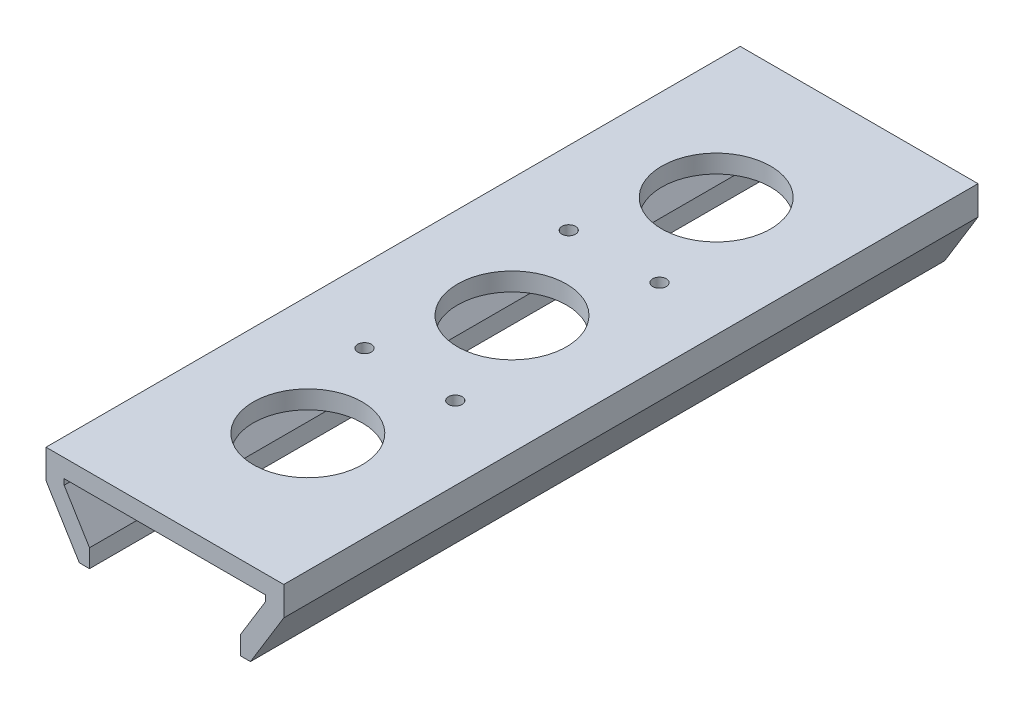
ISO-10303-21;
HEADER;
FILE_DESCRIPTION(('STEP AP214'),'2;1');
FILE_NAME('part.step','',(''),(''),'','','');
FILE_SCHEMA(('AUTOMOTIVE_DESIGN { 1 0 10303 214 1 1 1 1 }'));
ENDSEC;
DATA;
#1=APPLICATION_CONTEXT('core data for automotive mechanical design processes');
#2=APPLICATION_PROTOCOL_DEFINITION('international standard','automotive_design',2000,#1);
#3=PRODUCT_CONTEXT('',#1,'mechanical');
#4=PRODUCT('Part','Part','',(#3));
#5=PRODUCT_RELATED_PRODUCT_CATEGORY('part','',(#4));
#6=PRODUCT_DEFINITION_FORMATION('','',#4);
#7=PRODUCT_DEFINITION_CONTEXT('part definition',#1,'design');
#8=PRODUCT_DEFINITION('design','',#6,#7);
#9=PRODUCT_DEFINITION_SHAPE('','',#8);
#10=(LENGTH_UNIT() NAMED_UNIT(*) SI_UNIT(.MILLI.,.METRE.));
#11=(NAMED_UNIT(*) PLANE_ANGLE_UNIT() SI_UNIT($,.RADIAN.));
#12=(NAMED_UNIT(*) SI_UNIT($,.STERADIAN.) SOLID_ANGLE_UNIT());
#13=UNCERTAINTY_MEASURE_WITH_UNIT(LENGTH_MEASURE(1.E-05),#10,'distance_accuracy_value','');
#14=(GEOMETRIC_REPRESENTATION_CONTEXT(3) GLOBAL_UNCERTAINTY_ASSIGNED_CONTEXT((#13)) GLOBAL_UNIT_ASSIGNED_CONTEXT((#10,
#11,#12)) REPRESENTATION_CONTEXT('',''));
#15=CARTESIAN_POINT('',(0.,0.,0.));
#16=DIRECTION('',(0.,0.,1.));
#17=DIRECTION('',(1.,0.,0.));
#18=AXIS2_PLACEMENT_3D('',#15,#16,#17);
#19=CARTESIAN_POINT('',(0.,-13.28935446553,153.));
#20=DIRECTION('',(0.,-1.,0.));
#21=DIRECTION('',(1.,0.,0.));
#22=AXIS2_PLACEMENT_3D('',#19,#20,#21);
#23=PLANE('',#22);
#24=CARTESIAN_POINT('',(-9.99999999999999,-13.28935446553,54.));
#25=DIRECTION('',(0.,-1.,0.));
#26=DIRECTION('',(1.,0.,0.));
#27=AXIS2_PLACEMENT_3D('',#24,#25,#26);
#28=CIRCLE('',#27,1.5);
#29=CARTESIAN_POINT('',(-8.49999999999999,-13.28935446553,54.));
#30=VERTEX_POINT('',#29);
#31=EDGE_CURVE('E344',#30,#30,#28,.F.);
#32=ORIENTED_EDGE('',*,*,#31,.T.);
#33=EDGE_LOOP('',(#32));
#34=FACE_BOUND('',#33,.T.);
#35=CARTESIAN_POINT('',(10.,-13.28935446553,99.));
#36=DIRECTION('',(0.,-1.,0.));
#37=DIRECTION('',(1.,0.,0.));
#38=AXIS2_PLACEMENT_3D('',#35,#36,#37);
#39=CIRCLE('',#38,1.5);
#40=CARTESIAN_POINT('',(11.5,-13.28935446553,99.));
#41=VERTEX_POINT('',#40);
#42=EDGE_CURVE('E348',#41,#41,#39,.F.);
#43=ORIENTED_EDGE('',*,*,#42,.T.);
#44=EDGE_LOOP('',(#43));
#45=FACE_BOUND('',#44,.T.);
#46=CARTESIAN_POINT('',(0.,-13.28935446553,31.5));
#47=DIRECTION('',(0.,-1.,0.));
#48=DIRECTION('',(1.,0.,0.));
#49=AXIS2_PLACEMENT_3D('',#46,#47,#48);
#50=CIRCLE('',#49,12.);
#51=CARTESIAN_POINT('',(12.,-13.28935446553,31.5));
#52=VERTEX_POINT('',#51);
#53=EDGE_CURVE('E183',#52,#52,#50,.T.);
#54=ORIENTED_EDGE('',*,*,#53,.F.);
#55=EDGE_LOOP('',(#54));
#56=FACE_BOUND('',#55,.T.);
#57=CARTESIAN_POINT('',(0.,-13.28935446553,76.5));
#58=DIRECTION('',(0.,-1.,0.));
#59=DIRECTION('',(1.,0.,0.));
#60=AXIS2_PLACEMENT_3D('',#57,#58,#59);
#61=CIRCLE('',#60,12.);
#62=CARTESIAN_POINT('',(12.,-13.28935446553,76.5));
#63=VERTEX_POINT('',#62);
#64=EDGE_CURVE('E355',#63,#63,#61,.T.);
#65=ORIENTED_EDGE('',*,*,#64,.F.);
#66=EDGE_LOOP('',(#65));
#67=FACE_BOUND('',#66,.T.);
#68=CARTESIAN_POINT('',(0.,-13.28935446553,121.5));
#69=DIRECTION('',(0.,-1.,0.));
#70=DIRECTION('',(1.,0.,0.));
#71=AXIS2_PLACEMENT_3D('',#68,#69,#70);
#72=CIRCLE('',#71,12.);
#73=CARTESIAN_POINT('',(12.,-13.28935446553,121.5));
#74=VERTEX_POINT('',#73);
#75=EDGE_CURVE('E358',#74,#74,#72,.T.);
#76=ORIENTED_EDGE('',*,*,#75,.F.);
#77=EDGE_LOOP('',(#76));
#78=FACE_BOUND('',#77,.T.);
#79=DIRECTION('',(-1.,0.,0.));
#80=VECTOR('',#79,1.);
#81=CARTESIAN_POINT('',(0.,-13.28935446553,0.));
#82=LINE('',#81,#80);
#83=CARTESIAN_POINT('',(22.2,-13.28935446553,0.));
#84=VERTEX_POINT('',#83);
#85=CARTESIAN_POINT('',(-22.2,-13.28935446553,0.));
#86=VERTEX_POINT('',#85);
#87=EDGE_CURVE('E179',#84,#86,#82,.T.);
#88=ORIENTED_EDGE('',*,*,#87,.F.);
#89=DIRECTION('',(0.,0.,-1.));
#90=VECTOR('',#89,1.);
#91=CARTESIAN_POINT('',(22.2,-13.28935446553,153.));
#92=LINE('',#91,#90);
#93=CARTESIAN_POINT('',(22.2,-13.28935446553,153.));
#94=VERTEX_POINT('',#93);
#95=EDGE_CURVE('E11',#94,#84,#92,.T.);
#96=ORIENTED_EDGE('',*,*,#95,.F.);
#97=DIRECTION('',(-1.,0.,0.));
#98=VECTOR('',#97,1.);
#99=CARTESIAN_POINT('',(0.,-13.28935446553,153.));
#100=LINE('',#99,#98);
#101=CARTESIAN_POINT('',(-22.2,-13.28935446553,153.));
#102=VERTEX_POINT('',#101);
#103=EDGE_CURVE('E228',#94,#102,#100,.T.);
#104=ORIENTED_EDGE('',*,*,#103,.T.);
#105=DIRECTION('',(0.,0.,-1.));
#106=VECTOR('',#105,1.);
#107=CARTESIAN_POINT('',(-22.2,-13.28935446553,153.));
#108=LINE('',#107,#106);
#109=EDGE_CURVE('E62',#102,#86,#108,.T.);
#110=ORIENTED_EDGE('',*,*,#109,.T.);
#111=EDGE_LOOP('',(#88,#96,#104,#110));
#112=FACE_BOUND('',#111,.T.);
#113=CARTESIAN_POINT('',(-9.99999999999999,-13.28935446553,99.));
#114=DIRECTION('',(0.,-1.,0.));
#115=DIRECTION('',(1.,0.,0.));
#116=AXIS2_PLACEMENT_3D('',#113,#114,#115);
#117=CIRCLE('',#116,1.5);
#118=CARTESIAN_POINT('',(-8.49999999999999,-13.28935446553,99.));
#119=VERTEX_POINT('',#118);
#120=EDGE_CURVE('E363',#119,#119,#117,.T.);
#121=ORIENTED_EDGE('',*,*,#120,.F.);
#122=EDGE_LOOP('',(#121));
#123=FACE_BOUND('',#122,.T.);
#124=CARTESIAN_POINT('',(10.,-13.28935446553,54.));
#125=DIRECTION('',(0.,-1.,0.));
#126=DIRECTION('',(1.,0.,0.));
#127=AXIS2_PLACEMENT_3D('',#124,#125,#126);
#128=CIRCLE('',#127,1.5);
#129=CARTESIAN_POINT('',(11.5,-13.28935446553,54.));
#130=VERTEX_POINT('',#129);
#131=EDGE_CURVE('E366',#130,#130,#128,.T.);
#132=ORIENTED_EDGE('',*,*,#131,.F.);
#133=EDGE_LOOP('',(#132));
#134=FACE_BOUND('',#133,.T.);
#135=ADVANCED_FACE('F45',(#34,#45,#56,#67,#78,#112,#123,#134),#23,.T.);
#136=CARTESIAN_POINT('',(0.,-9.28935446553003,153.));
#137=DIRECTION('',(0.,1.,0.));
#138=DIRECTION('',(-1.,0.,0.));
#139=AXIS2_PLACEMENT_3D('',#136,#137,#138);
#140=PLANE('',#139);
#141=CARTESIAN_POINT('',(-9.99999999999999,-9.28935446553003,54.));
#142=DIRECTION('',(0.,-1.,0.));
#143=DIRECTION('',(1.,0.,0.));
#144=AXIS2_PLACEMENT_3D('',#141,#142,#143);
#145=CIRCLE('',#144,1.5);
#146=CARTESIAN_POINT('',(-8.49999999999999,-9.28935446553003,54.));
#147=VERTEX_POINT('',#146);
#148=EDGE_CURVE('E638',#147,#147,#145,.T.);
#149=ORIENTED_EDGE('',*,*,#148,.T.);
#150=EDGE_LOOP('',(#149));
#151=FACE_BOUND('',#150,.T.);
#152=CARTESIAN_POINT('',(10.,-9.28935446553003,99.));
#153=DIRECTION('',(0.,-1.,0.));
#154=DIRECTION('',(1.,0.,0.));
#155=AXIS2_PLACEMENT_3D('',#152,#153,#154);
#156=CIRCLE('',#155,1.5);
#157=CARTESIAN_POINT('',(11.5,-9.28935446553003,99.));
#158=VERTEX_POINT('',#157);
#159=EDGE_CURVE('E646',#158,#158,#156,.T.);
#160=ORIENTED_EDGE('',*,*,#159,.T.);
#161=EDGE_LOOP('',(#160));
#162=FACE_BOUND('',#161,.T.);
#163=CARTESIAN_POINT('',(0.,-9.28935446553003,31.5));
#164=DIRECTION('',(0.,1.,0.));
#165=DIRECTION('',(-1.,0.,0.));
#166=AXIS2_PLACEMENT_3D('',#163,#164,#165);
#167=CIRCLE('',#166,12.);
#168=CARTESIAN_POINT('',(-12.,-9.28935446553003,31.5));
#169=VERTEX_POINT('',#168);
#170=EDGE_CURVE('E379',#169,#169,#167,.T.);
#171=ORIENTED_EDGE('',*,*,#170,.F.);
#172=EDGE_LOOP('',(#171));
#173=FACE_BOUND('',#172,.T.);
#174=CARTESIAN_POINT('',(0.,-9.28935446553003,76.5));
#175=DIRECTION('',(0.,1.,0.));
#176=DIRECTION('',(-1.,0.,0.));
#177=AXIS2_PLACEMENT_3D('',#174,#175,#176);
#178=CIRCLE('',#177,12.);
#179=CARTESIAN_POINT('',(-12.,-9.28935446553003,76.5));
#180=VERTEX_POINT('',#179);
#181=EDGE_CURVE('E374',#180,#180,#178,.T.);
#182=ORIENTED_EDGE('',*,*,#181,.F.);
#183=EDGE_LOOP('',(#182));
#184=FACE_BOUND('',#183,.T.);
#185=CARTESIAN_POINT('',(0.,-9.28935446553003,121.5));
#186=DIRECTION('',(0.,1.,0.));
#187=DIRECTION('',(-1.,0.,0.));
#188=AXIS2_PLACEMENT_3D('',#185,#186,#187);
#189=CIRCLE('',#188,12.);
#190=CARTESIAN_POINT('',(-12.,-9.28935446553003,121.5));
#191=VERTEX_POINT('',#190);
#192=EDGE_CURVE('E369',#191,#191,#189,.T.);
#193=ORIENTED_EDGE('',*,*,#192,.F.);
#194=EDGE_LOOP('',(#193));
#195=FACE_BOUND('',#194,.T.);
#196=DIRECTION('',(1.,0.,0.));
#197=VECTOR('',#196,1.);
#198=CARTESIAN_POINT('',(0.,-9.28935446553003,0.));
#199=LINE('',#198,#197);
#200=CARTESIAN_POINT('',(-26.2,-9.28935446553003,0.));
#201=VERTEX_POINT('',#200);
#202=CARTESIAN_POINT('',(26.2,-9.28935446553003,0.));
#203=VERTEX_POINT('',#202);
#204=EDGE_CURVE('E205',#201,#203,#199,.T.);
#205=ORIENTED_EDGE('',*,*,#204,.F.);
#206=DIRECTION('',(0.,0.,-1.));
#207=VECTOR('',#206,1.);
#208=CARTESIAN_POINT('',(-26.2,-9.28935446553003,153.));
#209=LINE('',#208,#207);
#210=CARTESIAN_POINT('',(-26.2,-9.28935446553003,153.));
#211=VERTEX_POINT('',#210);
#212=EDGE_CURVE('E243',#211,#201,#209,.T.);
#213=ORIENTED_EDGE('',*,*,#212,.F.);
#214=DIRECTION('',(1.,0.,0.));
#215=VECTOR('',#214,1.);
#216=CARTESIAN_POINT('',(0.,-9.28935446553003,153.));
#217=LINE('',#216,#215);
#218=CARTESIAN_POINT('',(26.2,-9.28935446553003,153.));
#219=VERTEX_POINT('',#218);
#220=EDGE_CURVE('E301',#211,#219,#217,.T.);
#221=ORIENTED_EDGE('',*,*,#220,.T.);
#222=DIRECTION('',(0.,0.,-1.));
#223=VECTOR('',#222,1.);
#224=CARTESIAN_POINT('',(26.2,-9.28935446553003,153.));
#225=LINE('',#224,#223);
#226=EDGE_CURVE('E246',#219,#203,#225,.T.);
#227=ORIENTED_EDGE('',*,*,#226,.T.);
#228=EDGE_LOOP('',(#205,#213,#221,#227));
#229=FACE_BOUND('',#228,.T.);
#230=CARTESIAN_POINT('',(-9.99999999999999,-9.28935446553003,99.));
#231=DIRECTION('',(0.,1.,0.));
#232=DIRECTION('',(-1.,0.,0.));
#233=AXIS2_PLACEMENT_3D('',#230,#231,#232);
#234=CIRCLE('',#233,1.5);
#235=CARTESIAN_POINT('',(-11.5,-9.28935446553003,99.));
#236=VERTEX_POINT('',#235);
#237=EDGE_CURVE('E642',#236,#236,#234,.T.);
#238=ORIENTED_EDGE('',*,*,#237,.F.);
#239=EDGE_LOOP('',(#238));
#240=FACE_BOUND('',#239,.T.);
#241=CARTESIAN_POINT('',(10.,-9.28935446553003,54.));
#242=DIRECTION('',(0.,1.,0.));
#243=DIRECTION('',(-1.,0.,0.));
#244=AXIS2_PLACEMENT_3D('',#241,#242,#243);
#245=CIRCLE('',#244,1.5);
#246=CARTESIAN_POINT('',(8.5,-9.28935446553003,54.));
#247=VERTEX_POINT('',#246);
#248=EDGE_CURVE('E635',#247,#247,#245,.T.);
#249=ORIENTED_EDGE('',*,*,#248,.F.);
#250=EDGE_LOOP('',(#249));
#251=FACE_BOUND('',#250,.T.);
#252=ADVANCED_FACE('F333',(#151,#162,#173,#184,#195,#229,#240,#251),#140,.T.);
#253=CARTESIAN_POINT('',(22.2000000000001,-1.83929082197769E-13,153.));
#254=DIRECTION('',(1.,0.,0.));
#255=DIRECTION('',(0.,1.,0.));
#256=AXIS2_PLACEMENT_3D('',#253,#254,#255);
#257=PLANE('',#256);
#258=DIRECTION('',(0.,-1.,0.));
#259=VECTOR('',#258,1.);
#260=CARTESIAN_POINT('',(22.2000000000001,-1.83929082197769E-13,0.));
#261=LINE('',#260,#259);
#262=CARTESIAN_POINT('',(22.2,-14.5456276129797,0.));
#263=VERTEX_POINT('',#262);
#264=EDGE_CURVE('E182',#84,#263,#261,.T.);
#265=ORIENTED_EDGE('',*,*,#264,.T.);
#266=DIRECTION('',(0.,0.,-1.));
#267=VECTOR('',#266,1.);
#268=CARTESIAN_POINT('',(22.2,-14.5456276129797,153.));
#269=LINE('',#268,#267);
#270=CARTESIAN_POINT('',(22.2,-14.5456276129797,153.));
#271=VERTEX_POINT('',#270);
#272=EDGE_CURVE('E54',#271,#263,#269,.T.);
#273=ORIENTED_EDGE('',*,*,#272,.F.);
#274=DIRECTION('',(0.,-1.,0.));
#275=VECTOR('',#274,1.);
#276=CARTESIAN_POINT('',(22.2000000000001,-1.83929082197769E-13,153.));
#277=LINE('',#276,#275);
#278=EDGE_CURVE('E290',#94,#271,#277,.T.);
#279=ORIENTED_EDGE('',*,*,#278,.F.);
#280=ORIENTED_EDGE('',*,*,#95,.T.);
#281=EDGE_LOOP('',(#265,#273,#279,#280));
#282=FACE_BOUND('',#281,.T.);
#283=ADVANCED_FACE('F338',(#282),#257,.F.);
#284=CARTESIAN_POINT('',(22.6355826233033,-13.8328560475742,153.));
#285=DIRECTION('',(0.853281833651959,-0.521450009453975,0.));
#286=DIRECTION('',(0.521450009453975,0.853281833651959,0.));
#287=AXIS2_PLACEMENT_3D('',#284,#285,#286);
#288=PLANE('',#287);
#289=DIRECTION('',(-0.521450009453975,-0.853281833651959,0.));
#290=VECTOR('',#289,1.);
#291=CARTESIAN_POINT('',(22.6355826233033,-13.8328560475742,0.));
#292=LINE('',#291,#290);
#293=CARTESIAN_POINT('',(16.6121669234414,-23.68935446553,0.));
#294=VERTEX_POINT('',#293);
#295=EDGE_CURVE('E186',#263,#294,#292,.T.);
#296=ORIENTED_EDGE('',*,*,#295,.T.);
#297=DIRECTION('',(0.,0.,-1.));
#298=VECTOR('',#297,1.);
#299=CARTESIAN_POINT('',(16.6121669234414,-23.68935446553,153.));
#300=LINE('',#299,#298);
#301=CARTESIAN_POINT('',(16.6121669234414,-23.68935446553,153.));
#302=VERTEX_POINT('',#301);
#303=EDGE_CURVE('E258',#302,#294,#300,.T.);
#304=ORIENTED_EDGE('',*,*,#303,.F.);
#305=DIRECTION('',(-0.521450009453975,-0.853281833651959,0.));
#306=VECTOR('',#305,1.);
#307=CARTESIAN_POINT('',(22.6355826233033,-13.8328560475742,153.));
#308=LINE('',#307,#306);
#309=EDGE_CURVE('E269',#271,#302,#308,.T.);
#310=ORIENTED_EDGE('',*,*,#309,.F.);
#311=ORIENTED_EDGE('',*,*,#272,.T.);
#312=EDGE_LOOP('',(#296,#304,#310,#311));
#313=FACE_BOUND('',#312,.T.);
#314=ADVANCED_FACE('F267',(#313),#288,.F.);
#315=CARTESIAN_POINT('',(16.6121669234414,0.,153.));
#316=DIRECTION('',(1.,0.,0.));
#317=DIRECTION('',(0.,0.,-1.));
#318=AXIS2_PLACEMENT_3D('',#315,#316,#317);
#319=PLANE('',#318);
#320=DIRECTION('',(0.,-1.,0.));
#321=VECTOR('',#320,1.);
#322=CARTESIAN_POINT('',(16.6121669234414,0.,0.));
#323=LINE('',#322,#321);
#324=CARTESIAN_POINT('',(16.6121669234414,-27.68935446553,0.));
#325=VERTEX_POINT('',#324);
#326=EDGE_CURVE('E189',#294,#325,#323,.T.);
#327=ORIENTED_EDGE('',*,*,#326,.T.);
#328=DIRECTION('',(0.,0.,-1.));
#329=VECTOR('',#328,1.);
#330=CARTESIAN_POINT('',(16.6121669234414,-27.68935446553,153.));
#331=LINE('',#330,#329);
#332=CARTESIAN_POINT('',(16.6121669234414,-27.68935446553,153.));
#333=VERTEX_POINT('',#332);
#334=EDGE_CURVE('E255',#333,#325,#331,.T.);
#335=ORIENTED_EDGE('',*,*,#334,.F.);
#336=DIRECTION('',(0.,-1.,0.));
#337=VECTOR('',#336,1.);
#338=CARTESIAN_POINT('',(16.6121669234414,0.,153.));
#339=LINE('',#338,#337);
#340=EDGE_CURVE('E281',#302,#333,#339,.T.);
#341=ORIENTED_EDGE('',*,*,#340,.F.);
#342=ORIENTED_EDGE('',*,*,#303,.T.);
#343=EDGE_LOOP('',(#327,#335,#341,#342));
#344=FACE_BOUND('',#343,.T.);
#345=ADVANCED_FACE('F278',(#344),#319,.F.);
#346=CARTESIAN_POINT('',(0.,-27.68935446553,153.));
#347=DIRECTION('',(0.,-1.,0.));
#348=DIRECTION('',(0.,0.,-1.));
#349=AXIS2_PLACEMENT_3D('',#346,#347,#348);
#350=PLANE('',#349);
#351=DIRECTION('',(-1.,0.,0.));
#352=VECTOR('',#351,1.);
#353=CARTESIAN_POINT('',(0.,-27.68935446553,0.));
#354=LINE('',#353,#352);
#355=CARTESIAN_POINT('',(18.8555053922701,-27.68935446553,0.));
#356=VERTEX_POINT('',#355);
#357=EDGE_CURVE('E193',#356,#325,#354,.T.);
#358=ORIENTED_EDGE('',*,*,#357,.F.);
#359=DIRECTION('',(0.,0.,-1.));
#360=VECTOR('',#359,1.);
#361=CARTESIAN_POINT('',(18.8555053922701,-27.68935446553,153.));
#362=LINE('',#361,#360);
#363=CARTESIAN_POINT('',(18.8555053922701,-27.68935446553,153.));
#364=VERTEX_POINT('',#363);
#365=EDGE_CURVE('E252',#364,#356,#362,.T.);
#366=ORIENTED_EDGE('',*,*,#365,.F.);
#367=DIRECTION('',(-1.,0.,0.));
#368=VECTOR('',#367,1.);
#369=CARTESIAN_POINT('',(0.,-27.68935446553,153.));
#370=LINE('',#369,#368);
#371=EDGE_CURVE('E284',#364,#333,#370,.T.);
#372=ORIENTED_EDGE('',*,*,#371,.T.);
#373=ORIENTED_EDGE('',*,*,#334,.T.);
#374=EDGE_LOOP('',(#358,#366,#372,#373));
#375=FACE_BOUND('',#374,.T.);
#376=ADVANCED_FACE('F402',(#375),#350,.T.);
#377=CARTESIAN_POINT('',(26.0487099579111,-15.9186560853901,153.));
#378=DIRECTION('',(0.853281833651959,-0.521450009453975,0.));
#379=DIRECTION('',(0.521450009453975,0.853281833651959,0.));
#380=AXIS2_PLACEMENT_3D('',#377,#378,#379);
#381=PLANE('',#380);
#382=DIRECTION('',(-0.521450009453975,-0.853281833651959,0.));
#383=VECTOR('',#382,1.);
#384=CARTESIAN_POINT('',(26.0487099579111,-15.9186560853901,0.));
#385=LINE('',#384,#383);
#386=CARTESIAN_POINT('',(26.2,-15.671090561972,0.));
#387=VERTEX_POINT('',#386);
#388=EDGE_CURVE('E197',#387,#356,#385,.T.);
#389=ORIENTED_EDGE('',*,*,#388,.F.);
#390=DIRECTION('',(0.,0.,-1.));
#391=VECTOR('',#390,1.);
#392=CARTESIAN_POINT('',(26.2,-15.671090561972,153.));
#393=LINE('',#392,#391);
#394=CARTESIAN_POINT('',(26.2,-15.671090561972,153.));
#395=VERTEX_POINT('',#394);
#396=EDGE_CURVE('E249',#395,#387,#393,.T.);
#397=ORIENTED_EDGE('',*,*,#396,.F.);
#398=DIRECTION('',(-0.521450009453975,-0.853281833651959,0.));
#399=VECTOR('',#398,1.);
#400=CARTESIAN_POINT('',(26.0487099579111,-15.9186560853901,153.));
#401=LINE('',#400,#399);
#402=EDGE_CURVE('E288',#395,#364,#401,.T.);
#403=ORIENTED_EDGE('',*,*,#402,.T.);
#404=ORIENTED_EDGE('',*,*,#365,.T.);
#405=EDGE_LOOP('',(#389,#397,#403,#404));
#406=FACE_BOUND('',#405,.T.);
#407=ADVANCED_FACE('F405',(#406),#381,.T.);
#408=CARTESIAN_POINT('',(26.2,0.,153.));
#409=DIRECTION('',(1.,0.,0.));
#410=DIRECTION('',(0.,1.,0.));
#411=AXIS2_PLACEMENT_3D('',#408,#409,#410);
#412=PLANE('',#411);
#413=DIRECTION('',(0.,-1.,0.));
#414=VECTOR('',#413,1.);
#415=CARTESIAN_POINT('',(26.2,0.,0.));
#416=LINE('',#415,#414);
#417=EDGE_CURVE('E201',#203,#387,#416,.T.);
#418=ORIENTED_EDGE('',*,*,#417,.F.);
#419=ORIENTED_EDGE('',*,*,#226,.F.);
#420=DIRECTION('',(0.,-1.,0.));
#421=VECTOR('',#420,1.);
#422=CARTESIAN_POINT('',(26.2,0.,153.));
#423=LINE('',#422,#421);
#424=EDGE_CURVE('E297',#219,#395,#423,.T.);
#425=ORIENTED_EDGE('',*,*,#424,.T.);
#426=ORIENTED_EDGE('',*,*,#396,.T.);
#427=EDGE_LOOP('',(#418,#419,#425,#426));
#428=FACE_BOUND('',#427,.T.);
#429=ADVANCED_FACE('F409',(#428),#412,.T.);
#430=CARTESIAN_POINT('',(-26.2,0.,153.));
#431=DIRECTION('',(1.,0.,0.));
#432=DIRECTION('',(0.,1.,0.));
#433=AXIS2_PLACEMENT_3D('',#430,#431,#432);
#434=PLANE('',#433);
#435=DIRECTION('',(0.,-1.,0.));
#436=VECTOR('',#435,1.);
#437=CARTESIAN_POINT('',(-26.2,0.,0.));
#438=LINE('',#437,#436);
#439=CARTESIAN_POINT('',(-26.2,-15.671090561972,0.));
#440=VERTEX_POINT('',#439);
#441=EDGE_CURVE('E209',#201,#440,#438,.T.);
#442=ORIENTED_EDGE('',*,*,#441,.T.);
#443=DIRECTION('',(0.,0.,-1.));
#444=VECTOR('',#443,1.);
#445=CARTESIAN_POINT('',(-26.2,-15.671090561972,153.));
#446=LINE('',#445,#444);
#447=CARTESIAN_POINT('',(-26.2,-15.671090561972,153.));
#448=VERTEX_POINT('',#447);
#449=EDGE_CURVE('E239',#448,#440,#446,.T.);
#450=ORIENTED_EDGE('',*,*,#449,.F.);
#451=DIRECTION('',(0.,-1.,0.));
#452=VECTOR('',#451,1.);
#453=CARTESIAN_POINT('',(-26.2,0.,153.));
#454=LINE('',#453,#452);
#455=EDGE_CURVE('E305',#211,#448,#454,.T.);
#456=ORIENTED_EDGE('',*,*,#455,.F.);
#457=ORIENTED_EDGE('',*,*,#212,.T.);
#458=EDGE_LOOP('',(#442,#450,#456,#457));
#459=FACE_BOUND('',#458,.T.);
#460=ADVANCED_FACE('F412',(#459),#434,.F.);
#461=CARTESIAN_POINT('',(-26.0487099579112,-15.9186560853901,153.));
#462=DIRECTION('',(0.853281833651959,0.521450009453975,0.));
#463=DIRECTION('',(-0.521450009453975,0.853281833651959,0.));
#464=AXIS2_PLACEMENT_3D('',#461,#462,#463);
#465=PLANE('',#464);
#466=DIRECTION('',(0.521450009453975,-0.853281833651959,0.));
#467=VECTOR('',#466,1.);
#468=CARTESIAN_POINT('',(-26.0487099579112,-15.9186560853901,0.));
#469=LINE('',#468,#467);
#470=CARTESIAN_POINT('',(-18.8555053922701,-27.68935446553,0.));
#471=VERTEX_POINT('',#470);
#472=EDGE_CURVE('E212',#440,#471,#469,.T.);
#473=ORIENTED_EDGE('',*,*,#472,.T.);
#474=DIRECTION('',(0.,0.,-1.));
#475=VECTOR('',#474,1.);
#476=CARTESIAN_POINT('',(-18.8555053922701,-27.68935446553,153.));
#477=LINE('',#476,#475);
#478=CARTESIAN_POINT('',(-18.8555053922701,-27.68935446553,153.));
#479=VERTEX_POINT('',#478);
#480=EDGE_CURVE('E235',#479,#471,#477,.T.);
#481=ORIENTED_EDGE('',*,*,#480,.F.);
#482=DIRECTION('',(0.521450009453975,-0.853281833651959,0.));
#483=VECTOR('',#482,1.);
#484=CARTESIAN_POINT('',(-26.0487099579112,-15.9186560853901,153.));
#485=LINE('',#484,#483);
#486=EDGE_CURVE('E308',#448,#479,#485,.T.);
#487=ORIENTED_EDGE('',*,*,#486,.F.);
#488=ORIENTED_EDGE('',*,*,#449,.T.);
#489=EDGE_LOOP('',(#473,#481,#487,#488));
#490=FACE_BOUND('',#489,.T.);
#491=ADVANCED_FACE('F317',(#490),#465,.F.);
#492=CARTESIAN_POINT('',(0.,-27.68935446553,153.));
#493=DIRECTION('',(0.,1.,0.));
#494=DIRECTION('',(0.,0.,1.));
#495=AXIS2_PLACEMENT_3D('',#492,#493,#494);
#496=PLANE('',#495);
#497=DIRECTION('',(1.,0.,0.));
#498=VECTOR('',#497,1.);
#499=CARTESIAN_POINT('',(0.,-27.68935446553,0.));
#500=LINE('',#499,#498);
#501=CARTESIAN_POINT('',(-16.6121669234414,-27.68935446553,0.));
#502=VERTEX_POINT('',#501);
#503=EDGE_CURVE('E215',#471,#502,#500,.T.);
#504=ORIENTED_EDGE('',*,*,#503,.T.);
#505=DIRECTION('',(0.,0.,-1.));
#506=VECTOR('',#505,1.);
#507=CARTESIAN_POINT('',(-16.6121669234414,-27.68935446553,153.));
#508=LINE('',#507,#506);
#509=CARTESIAN_POINT('',(-16.6121669234414,-27.68935446553,153.));
#510=VERTEX_POINT('',#509);
#511=EDGE_CURVE('E158',#510,#502,#508,.T.);
#512=ORIENTED_EDGE('',*,*,#511,.F.);
#513=DIRECTION('',(1.,0.,0.));
#514=VECTOR('',#513,1.);
#515=CARTESIAN_POINT('',(0.,-27.68935446553,153.));
#516=LINE('',#515,#514);
#517=EDGE_CURVE('E167',#479,#510,#516,.T.);
#518=ORIENTED_EDGE('',*,*,#517,.F.);
#519=ORIENTED_EDGE('',*,*,#480,.T.);
#520=EDGE_LOOP('',(#504,#512,#518,#519));
#521=FACE_BOUND('',#520,.T.);
#522=ADVANCED_FACE('F321',(#521),#496,.F.);
#523=CARTESIAN_POINT('',(-16.6121669234414,0.,153.));
#524=DIRECTION('',(1.,0.,0.));
#525=DIRECTION('',(0.,0.,-1.));
#526=AXIS2_PLACEMENT_3D('',#523,#524,#525);
#527=PLANE('',#526);
#528=DIRECTION('',(0.,-1.,0.));
#529=VECTOR('',#528,1.);
#530=CARTESIAN_POINT('',(-16.6121669234414,0.,0.));
#531=LINE('',#530,#529);
#532=CARTESIAN_POINT('',(-16.6121669234414,-23.68935446553,0.));
#533=VERTEX_POINT('',#532);
#534=EDGE_CURVE('E153',#533,#502,#531,.T.);
#535=ORIENTED_EDGE('',*,*,#534,.F.);
#536=DIRECTION('',(0.,0.,-1.));
#537=VECTOR('',#536,1.);
#538=CARTESIAN_POINT('',(-16.6121669234414,-23.68935446553,153.));
#539=LINE('',#538,#537);
#540=CARTESIAN_POINT('',(-16.6121669234414,-23.68935446553,153.));
#541=VERTEX_POINT('',#540);
#542=EDGE_CURVE('E148',#541,#533,#539,.T.);
#543=ORIENTED_EDGE('',*,*,#542,.F.);
#544=DIRECTION('',(0.,-1.,0.));
#545=VECTOR('',#544,1.);
#546=CARTESIAN_POINT('',(-16.6121669234414,0.,153.));
#547=LINE('',#546,#545);
#548=EDGE_CURVE('E151',#541,#510,#547,.T.);
#549=ORIENTED_EDGE('',*,*,#548,.T.);
#550=ORIENTED_EDGE('',*,*,#511,.T.);
#551=EDGE_LOOP('',(#535,#543,#549,#550));
#552=FACE_BOUND('',#551,.T.);
#553=ADVANCED_FACE('F150',(#552),#527,.T.);
#554=CARTESIAN_POINT('',(-22.6355826233033,-13.8328560475742,153.));
#555=DIRECTION('',(0.853281833651959,0.521450009453975,0.));
#556=DIRECTION('',(-0.521450009453975,0.853281833651959,0.));
#557=AXIS2_PLACEMENT_3D('',#554,#555,#556);
#558=PLANE('',#557);
#559=DIRECTION('',(0.521450009453975,-0.853281833651959,0.));
#560=VECTOR('',#559,1.);
#561=CARTESIAN_POINT('',(-22.6355826233033,-13.8328560475742,0.));
#562=LINE('',#561,#560);
#563=CARTESIAN_POINT('',(-22.2,-14.5456276129797,0.));
#564=VERTEX_POINT('',#563);
#565=EDGE_CURVE('E221',#564,#533,#562,.T.);
#566=ORIENTED_EDGE('',*,*,#565,.F.);
#567=DIRECTION('',(0.,0.,-1.));
#568=VECTOR('',#567,1.);
#569=CARTESIAN_POINT('',(-22.2,-14.5456276129797,153.));
#570=LINE('',#569,#568);
#571=CARTESIAN_POINT('',(-22.2,-14.5456276129797,153.));
#572=VERTEX_POINT('',#571);
#573=EDGE_CURVE('E105',#572,#564,#570,.T.);
#574=ORIENTED_EDGE('',*,*,#573,.F.);
#575=DIRECTION('',(0.521450009453975,-0.853281833651959,0.));
#576=VECTOR('',#575,1.);
#577=CARTESIAN_POINT('',(-22.6355826233033,-13.8328560475742,153.));
#578=LINE('',#577,#576);
#579=EDGE_CURVE('E165',#572,#541,#578,.T.);
#580=ORIENTED_EDGE('',*,*,#579,.T.);
#581=ORIENTED_EDGE('',*,*,#542,.T.);
#582=EDGE_LOOP('',(#566,#574,#580,#581));
#583=FACE_BOUND('',#582,.T.);
#584=ADVANCED_FACE('F171',(#583),#558,.T.);
#585=CARTESIAN_POINT('',(-22.1999999999999,1.83929082197766E-13,153.));
#586=DIRECTION('',(1.,0.,0.));
#587=DIRECTION('',(0.,1.,0.));
#588=AXIS2_PLACEMENT_3D('',#585,#586,#587);
#589=PLANE('',#588);
#590=DIRECTION('',(0.,-1.,0.));
#591=VECTOR('',#590,1.);
#592=CARTESIAN_POINT('',(-22.1999999999999,1.83929082197766E-13,0.));
#593=LINE('',#592,#591);
#594=EDGE_CURVE('E224',#86,#564,#593,.T.);
#595=ORIENTED_EDGE('',*,*,#594,.F.);
#596=ORIENTED_EDGE('',*,*,#109,.F.);
#597=DIRECTION('',(0.,-1.,0.));
#598=VECTOR('',#597,1.);
#599=CARTESIAN_POINT('',(-22.1999999999999,1.83929082197766E-13,153.));
#600=LINE('',#599,#598);
#601=EDGE_CURVE('E173',#102,#572,#600,.T.);
#602=ORIENTED_EDGE('',*,*,#601,.T.);
#603=ORIENTED_EDGE('',*,*,#573,.T.);
#604=EDGE_LOOP('',(#595,#596,#602,#603));
#605=FACE_BOUND('',#604,.T.);
#606=ADVANCED_FACE('F322',(#605),#589,.T.);
#607=CARTESIAN_POINT('',(0.,0.,153.));
#608=DIRECTION('',(0.,0.,1.));
#609=DIRECTION('',(1.,0.,0.));
#610=AXIS2_PLACEMENT_3D('',#607,#608,#609);
#611=PLANE('',#610);
#612=ORIENTED_EDGE('',*,*,#103,.F.);
#613=ORIENTED_EDGE('',*,*,#278,.T.);
#614=ORIENTED_EDGE('',*,*,#309,.T.);
#615=ORIENTED_EDGE('',*,*,#340,.T.);
#616=ORIENTED_EDGE('',*,*,#371,.F.);
#617=ORIENTED_EDGE('',*,*,#402,.F.);
#618=ORIENTED_EDGE('',*,*,#424,.F.);
#619=ORIENTED_EDGE('',*,*,#220,.F.);
#620=ORIENTED_EDGE('',*,*,#455,.T.);
#621=ORIENTED_EDGE('',*,*,#486,.T.);
#622=ORIENTED_EDGE('',*,*,#517,.T.);
#623=ORIENTED_EDGE('',*,*,#548,.F.);
#624=ORIENTED_EDGE('',*,*,#579,.F.);
#625=ORIENTED_EDGE('',*,*,#601,.F.);
#626=EDGE_LOOP('',(#612,#613,#614,#615,#616,#617,#618,#619,#620,#621,#622,#623,#624,#625));
#627=FACE_BOUND('',#626,.T.);
#628=ADVANCED_FACE('F163',(#627),#611,.T.);
#629=CARTESIAN_POINT('',(0.,0.,0.));
#630=DIRECTION('',(0.,0.,1.));
#631=DIRECTION('',(1.,0.,0.));
#632=AXIS2_PLACEMENT_3D('',#629,#630,#631);
#633=PLANE('',#632);
#634=ORIENTED_EDGE('',*,*,#87,.T.);
#635=ORIENTED_EDGE('',*,*,#594,.T.);
#636=ORIENTED_EDGE('',*,*,#565,.T.);
#637=ORIENTED_EDGE('',*,*,#534,.T.);
#638=ORIENTED_EDGE('',*,*,#503,.F.);
#639=ORIENTED_EDGE('',*,*,#472,.F.);
#640=ORIENTED_EDGE('',*,*,#441,.F.);
#641=ORIENTED_EDGE('',*,*,#204,.T.);
#642=ORIENTED_EDGE('',*,*,#417,.T.);
#643=ORIENTED_EDGE('',*,*,#388,.T.);
#644=ORIENTED_EDGE('',*,*,#357,.T.);
#645=ORIENTED_EDGE('',*,*,#326,.F.);
#646=ORIENTED_EDGE('',*,*,#295,.F.);
#647=ORIENTED_EDGE('',*,*,#264,.F.);
#648=EDGE_LOOP('',(#634,#635,#636,#637,#638,#639,#640,#641,#642,#643,#644,#645,#646,#647));
#649=FACE_BOUND('',#648,.T.);
#650=ADVANCED_FACE('F274',(#649),#633,.F.);
#651=CARTESIAN_POINT('',(0.,-222.28935446553,121.5));
#652=DIRECTION('',(0.,1.,0.));
#653=DIRECTION('',(-1.,0.,0.));
#654=AXIS2_PLACEMENT_3D('',#651,#652,#653);
#655=CYLINDRICAL_SURFACE('',#654,12.);
#656=ORIENTED_EDGE('',*,*,#75,.T.);
#657=EDGE_LOOP('',(#656));
#658=FACE_BOUND('',#657,.T.);
#659=ORIENTED_EDGE('',*,*,#192,.T.);
#660=EDGE_LOOP('',(#659));
#661=FACE_BOUND('',#660,.T.);
#662=ADVANCED_FACE('F453',(#658,#661),#655,.F.);
#663=CARTESIAN_POINT('',(0.,-222.28935446553,76.5));
#664=DIRECTION('',(0.,1.,0.));
#665=DIRECTION('',(-1.,0.,0.));
#666=AXIS2_PLACEMENT_3D('',#663,#664,#665);
#667=CYLINDRICAL_SURFACE('',#666,12.);
#668=ORIENTED_EDGE('',*,*,#64,.T.);
#669=EDGE_LOOP('',(#668));
#670=FACE_BOUND('',#669,.T.);
#671=ORIENTED_EDGE('',*,*,#181,.T.);
#672=EDGE_LOOP('',(#671));
#673=FACE_BOUND('',#672,.T.);
#674=ADVANCED_FACE('F462',(#670,#673),#667,.F.);
#675=CARTESIAN_POINT('',(0.,-222.28935446553,31.5));
#676=DIRECTION('',(0.,1.,0.));
#677=DIRECTION('',(-1.,0.,0.));
#678=AXIS2_PLACEMENT_3D('',#675,#676,#677);
#679=CYLINDRICAL_SURFACE('',#678,12.);
#680=ORIENTED_EDGE('',*,*,#53,.T.);
#681=EDGE_LOOP('',(#680));
#682=FACE_BOUND('',#681,.T.);
#683=ORIENTED_EDGE('',*,*,#170,.T.);
#684=EDGE_LOOP('',(#683));
#685=FACE_BOUND('',#684,.T.);
#686=ADVANCED_FACE('F473',(#682,#685),#679,.F.);
#687=CARTESIAN_POINT('',(10.,-19.28935446553,99.));
#688=DIRECTION('',(0.,1.,0.));
#689=DIRECTION('',(-1.,0.,0.));
#690=AXIS2_PLACEMENT_3D('',#687,#688,#689);
#691=CYLINDRICAL_SURFACE('',#690,1.5);
#692=ORIENTED_EDGE('',*,*,#42,.F.);
#693=EDGE_LOOP('',(#692));
#694=FACE_BOUND('',#693,.T.);
#695=ORIENTED_EDGE('',*,*,#159,.F.);
#696=EDGE_LOOP('',(#695));
#697=FACE_BOUND('',#696,.T.);
#698=ADVANCED_FACE('F483',(#694,#697),#691,.F.);
#699=CARTESIAN_POINT('',(-9.99999999999999,-19.28935446553,99.));
#700=DIRECTION('',(0.,1.,0.));
#701=DIRECTION('',(-1.,0.,0.));
#702=AXIS2_PLACEMENT_3D('',#699,#700,#701);
#703=CYLINDRICAL_SURFACE('',#702,1.5);
#704=ORIENTED_EDGE('',*,*,#120,.T.);
#705=EDGE_LOOP('',(#704));
#706=FACE_BOUND('',#705,.T.);
#707=ORIENTED_EDGE('',*,*,#237,.T.);
#708=EDGE_LOOP('',(#707));
#709=FACE_BOUND('',#708,.T.);
#710=ADVANCED_FACE('F507',(#706,#709),#703,.F.);
#711=CARTESIAN_POINT('',(-9.99999999999999,-19.28935446553,54.));
#712=DIRECTION('',(0.,1.,0.));
#713=DIRECTION('',(-1.,0.,0.));
#714=AXIS2_PLACEMENT_3D('',#711,#712,#713);
#715=CYLINDRICAL_SURFACE('',#714,1.5);
#716=ORIENTED_EDGE('',*,*,#31,.F.);
#717=EDGE_LOOP('',(#716));
#718=FACE_BOUND('',#717,.T.);
#719=ORIENTED_EDGE('',*,*,#148,.F.);
#720=EDGE_LOOP('',(#719));
#721=FACE_BOUND('',#720,.T.);
#722=ADVANCED_FACE('F518',(#718,#721),#715,.F.);
#723=CARTESIAN_POINT('',(10.,-19.28935446553,54.));
#724=DIRECTION('',(0.,1.,0.));
#725=DIRECTION('',(-1.,0.,0.));
#726=AXIS2_PLACEMENT_3D('',#723,#724,#725);
#727=CYLINDRICAL_SURFACE('',#726,1.5);
#728=ORIENTED_EDGE('',*,*,#131,.T.);
#729=EDGE_LOOP('',(#728));
#730=FACE_BOUND('',#729,.T.);
#731=ORIENTED_EDGE('',*,*,#248,.T.);
#732=EDGE_LOOP('',(#731));
#733=FACE_BOUND('',#732,.T.);
#734=ADVANCED_FACE('F529',(#730,#733),#727,.F.);
#735=CLOSED_SHELL('',(#135,#252,#283,#314,#345,#376,#407,#429,#460,#491,#522,#553,#584,#606,
#628,#650,#662,#674,#686,#698,#710,#722,#734));
#736=MANIFOLD_SOLID_BREP('B2',#735);
#737=ADVANCED_BREP_SHAPE_REPRESENTATION('',(#18,#736),#14);
#738=SHAPE_DEFINITION_REPRESENTATION(#9,#737);
ENDSEC;
END-ISO-10303-21;
